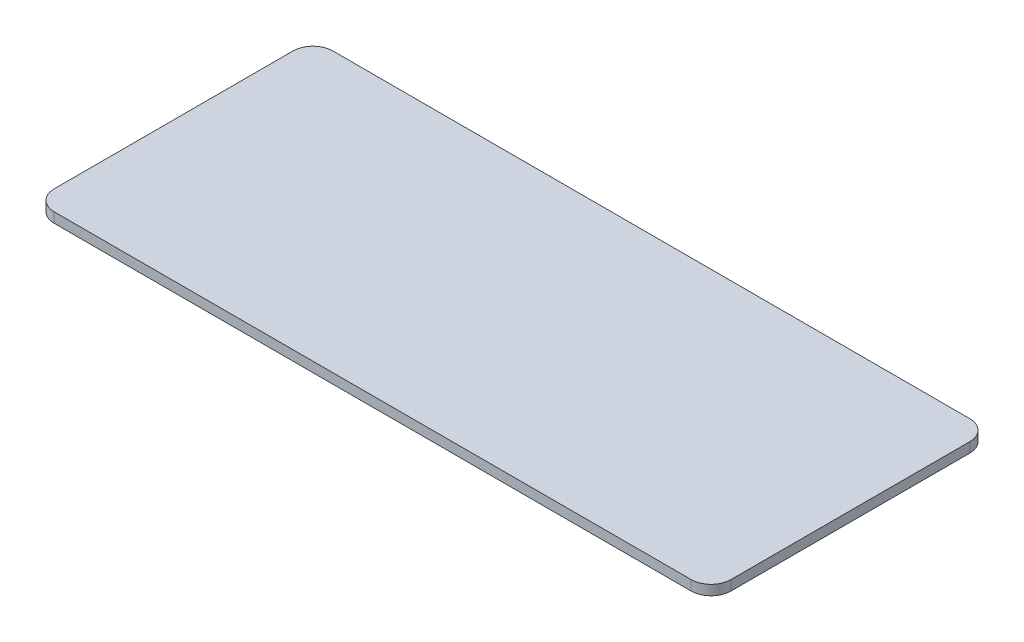
ISO-10303-21;
HEADER;
FILE_DESCRIPTION(('STEP AP214'),'2;1');
FILE_NAME('part.step','',(''),(''),'','','');
FILE_SCHEMA(('AUTOMOTIVE_DESIGN { 1 0 10303 214 1 1 1 1 }'));
ENDSEC;
DATA;
#1=APPLICATION_CONTEXT('core data for automotive mechanical design processes');
#2=APPLICATION_PROTOCOL_DEFINITION('international standard','automotive_design',2000,#1);
#3=PRODUCT_CONTEXT('',#1,'mechanical');
#4=PRODUCT('Part','Part','',(#3));
#5=PRODUCT_RELATED_PRODUCT_CATEGORY('part','',(#4));
#6=PRODUCT_DEFINITION_FORMATION('','',#4);
#7=PRODUCT_DEFINITION_CONTEXT('part definition',#1,'design');
#8=PRODUCT_DEFINITION('design','',#6,#7);
#9=PRODUCT_DEFINITION_SHAPE('','',#8);
#10=(LENGTH_UNIT() NAMED_UNIT(*) SI_UNIT(.MILLI.,.METRE.));
#11=(NAMED_UNIT(*) PLANE_ANGLE_UNIT() SI_UNIT($,.RADIAN.));
#12=(NAMED_UNIT(*) SI_UNIT($,.STERADIAN.) SOLID_ANGLE_UNIT());
#13=UNCERTAINTY_MEASURE_WITH_UNIT(LENGTH_MEASURE(1.E-05),#10,'distance_accuracy_value','');
#14=(GEOMETRIC_REPRESENTATION_CONTEXT(3) GLOBAL_UNCERTAINTY_ASSIGNED_CONTEXT((#13)) GLOBAL_UNIT_ASSIGNED_CONTEXT((#10,
#11,#12)) REPRESENTATION_CONTEXT('',''));
#15=CARTESIAN_POINT('',(0.,0.,0.));
#16=DIRECTION('',(0.,0.,1.));
#17=DIRECTION('',(1.,0.,0.));
#18=AXIS2_PLACEMENT_3D('',#15,#16,#17);
#19=CARTESIAN_POINT('',(30.6331658291457,1.,-12.7788944723618));
#20=DIRECTION('',(0.,-1.,0.));
#21=DIRECTION('',(0.,0.,-1.));
#22=AXIS2_PLACEMENT_3D('',#19,#20,#21);
#23=CYLINDRICAL_SURFACE('',#22,2.);
#24=CARTESIAN_POINT('',(30.6331658291457,0.,-12.7788944723618));
#25=DIRECTION('',(0.,1.,0.));
#26=DIRECTION('',(0.,0.,-1.));
#27=AXIS2_PLACEMENT_3D('',#24,#25,#26);
#28=CIRCLE('',#27,2.);
#29=CARTESIAN_POINT('',(32.6331658291457,0.,-12.7788944723618));
#30=VERTEX_POINT('',#29);
#31=CARTESIAN_POINT('',(30.6331658291457,0.,-14.7788944723618));
#32=VERTEX_POINT('',#31);
#33=EDGE_CURVE('E129',#30,#32,#28,.T.);
#34=ORIENTED_EDGE('',*,*,#33,.T.);
#35=DIRECTION('',(0.,-1.,0.));
#36=VECTOR('',#35,1.);
#37=CARTESIAN_POINT('',(30.6331658291457,1.,-14.7788944723618));
#38=LINE('',#37,#36);
#39=CARTESIAN_POINT('',(30.6331658291457,1.,-14.7788944723618));
#40=VERTEX_POINT('',#39);
#41=EDGE_CURVE('E11',#40,#32,#38,.T.);
#42=ORIENTED_EDGE('',*,*,#41,.F.);
#43=CARTESIAN_POINT('',(30.6331658291457,1.,-12.7788944723618));
#44=DIRECTION('',(0.,1.,0.));
#45=DIRECTION('',(0.,0.,-1.));
#46=AXIS2_PLACEMENT_3D('',#43,#44,#45);
#47=CIRCLE('',#46,2.);
#48=CARTESIAN_POINT('',(32.6331658291457,1.,-12.7788944723618));
#49=VERTEX_POINT('',#48);
#50=EDGE_CURVE('E143',#49,#40,#47,.T.);
#51=ORIENTED_EDGE('',*,*,#50,.F.);
#52=DIRECTION('',(0.,-1.,0.));
#53=VECTOR('',#52,1.);
#54=CARTESIAN_POINT('',(32.6331658291457,1.,-12.7788944723618));
#55=LINE('',#54,#53);
#56=EDGE_CURVE('E125',#49,#30,#55,.T.);
#57=ORIENTED_EDGE('',*,*,#56,.T.);
#58=EDGE_LOOP('',(#34,#42,#51,#57));
#59=FACE_BOUND('',#58,.T.);
#60=ADVANCED_FACE('F33',(#59),#23,.T.);
#61=CARTESIAN_POINT('',(-33.3668341708543,1.,-14.7788944723618));
#62=DIRECTION('',(0.,0.,1.));
#63=DIRECTION('',(1.,0.,0.));
#64=AXIS2_PLACEMENT_3D('',#61,#62,#63);
#65=PLANE('',#64);
#66=DIRECTION('',(-1.,0.,0.));
#67=VECTOR('',#66,1.);
#68=CARTESIAN_POINT('',(-33.3668341708543,0.,-14.7788944723618));
#69=LINE('',#68,#67);
#70=CARTESIAN_POINT('',(-33.3668341708543,0.,-14.7788944723618));
#71=VERTEX_POINT('',#70);
#72=EDGE_CURVE('E132',#32,#71,#69,.T.);
#73=ORIENTED_EDGE('',*,*,#72,.T.);
#74=DIRECTION('',(0.,-1.,0.));
#75=VECTOR('',#74,1.);
#76=CARTESIAN_POINT('',(-33.3668341708543,1.,-14.7788944723618));
#77=LINE('',#76,#75);
#78=CARTESIAN_POINT('',(-33.3668341708543,1.,-14.7788944723618));
#79=VERTEX_POINT('',#78);
#80=EDGE_CURVE('E41',#79,#71,#77,.T.);
#81=ORIENTED_EDGE('',*,*,#80,.F.);
#82=DIRECTION('',(-1.,0.,0.));
#83=VECTOR('',#82,1.);
#84=CARTESIAN_POINT('',(-33.3668341708543,1.,-14.7788944723618));
#85=LINE('',#84,#83);
#86=EDGE_CURVE('E92',#40,#79,#85,.T.);
#87=ORIENTED_EDGE('',*,*,#86,.F.);
#88=ORIENTED_EDGE('',*,*,#41,.T.);
#89=EDGE_LOOP('',(#73,#81,#87,#88));
#90=FACE_BOUND('',#89,.T.);
#91=ADVANCED_FACE('F178',(#90),#65,.F.);
#92=CARTESIAN_POINT('',(-33.3668341708543,1.,-12.7788944723618));
#93=DIRECTION('',(0.,-1.,0.));
#94=DIRECTION('',(0.,0.,-1.));
#95=AXIS2_PLACEMENT_3D('',#92,#93,#94);
#96=CYLINDRICAL_SURFACE('',#95,2.);
#97=CARTESIAN_POINT('',(-33.3668341708543,0.,-12.7788944723618));
#98=DIRECTION('',(0.,1.,0.));
#99=DIRECTION('',(0.,0.,1.));
#100=AXIS2_PLACEMENT_3D('',#97,#98,#99);
#101=CIRCLE('',#100,2.);
#102=CARTESIAN_POINT('',(-35.3668341708543,0.,-12.7788944723618));
#103=VERTEX_POINT('',#102);
#104=EDGE_CURVE('E134',#71,#103,#101,.T.);
#105=ORIENTED_EDGE('',*,*,#104,.T.);
#106=DIRECTION('',(0.,-1.,0.));
#107=VECTOR('',#106,1.);
#108=CARTESIAN_POINT('',(-35.3668341708543,1.,-12.7788944723618));
#109=LINE('',#108,#107);
#110=CARTESIAN_POINT('',(-35.3668341708543,1.,-12.7788944723618));
#111=VERTEX_POINT('',#110);
#112=EDGE_CURVE('E150',#111,#103,#109,.T.);
#113=ORIENTED_EDGE('',*,*,#112,.F.);
#114=CARTESIAN_POINT('',(-33.3668341708543,1.,-12.7788944723618));
#115=DIRECTION('',(0.,1.,0.));
#116=DIRECTION('',(0.,0.,1.));
#117=AXIS2_PLACEMENT_3D('',#114,#115,#116);
#118=CIRCLE('',#117,2.);
#119=EDGE_CURVE('E158',#79,#111,#118,.T.);
#120=ORIENTED_EDGE('',*,*,#119,.F.);
#121=ORIENTED_EDGE('',*,*,#80,.T.);
#122=EDGE_LOOP('',(#105,#113,#120,#121));
#123=FACE_BOUND('',#122,.T.);
#124=ADVANCED_FACE('F156',(#123),#96,.T.);
#125=CARTESIAN_POINT('',(-35.3668341708543,1.,-12.7788944723618));
#126=DIRECTION('',(1.,0.,0.));
#127=DIRECTION('',(0.,0.,-1.));
#128=AXIS2_PLACEMENT_3D('',#125,#126,#127);
#129=PLANE('',#128);
#130=DIRECTION('',(0.,0.,1.));
#131=VECTOR('',#130,1.);
#132=CARTESIAN_POINT('',(-35.3668341708543,0.,-12.7788944723618));
#133=LINE('',#132,#131);
#134=CARTESIAN_POINT('',(-35.3668341708543,0.,11.2211055276382));
#135=VERTEX_POINT('',#134);
#136=EDGE_CURVE('E136',#103,#135,#133,.T.);
#137=ORIENTED_EDGE('',*,*,#136,.T.);
#138=DIRECTION('',(0.,-1.,0.));
#139=VECTOR('',#138,1.);
#140=CARTESIAN_POINT('',(-35.3668341708543,1.,11.2211055276382));
#141=LINE('',#140,#139);
#142=CARTESIAN_POINT('',(-35.3668341708543,1.,11.2211055276382));
#143=VERTEX_POINT('',#142);
#144=EDGE_CURVE('E147',#143,#135,#141,.T.);
#145=ORIENTED_EDGE('',*,*,#144,.F.);
#146=DIRECTION('',(0.,0.,1.));
#147=VECTOR('',#146,1.);
#148=CARTESIAN_POINT('',(-35.3668341708543,1.,-12.7788944723618));
#149=LINE('',#148,#147);
#150=EDGE_CURVE('E170',#111,#143,#149,.T.);
#151=ORIENTED_EDGE('',*,*,#150,.F.);
#152=ORIENTED_EDGE('',*,*,#112,.T.);
#153=EDGE_LOOP('',(#137,#145,#151,#152));
#154=FACE_BOUND('',#153,.T.);
#155=ADVANCED_FACE('F166',(#154),#129,.F.);
#156=CARTESIAN_POINT('',(-33.3668341708543,1.,11.2211055276382));
#157=DIRECTION('',(0.,-1.,0.));
#158=DIRECTION('',(0.,0.,-1.));
#159=AXIS2_PLACEMENT_3D('',#156,#157,#158);
#160=CYLINDRICAL_SURFACE('',#159,2.);
#161=CARTESIAN_POINT('',(-33.3668341708543,0.,11.2211055276382));
#162=DIRECTION('',(0.,1.,0.));
#163=DIRECTION('',(0.,0.,1.));
#164=AXIS2_PLACEMENT_3D('',#161,#162,#163);
#165=CIRCLE('',#164,2.);
#166=CARTESIAN_POINT('',(-33.3668341708543,0.,13.2211055276382));
#167=VERTEX_POINT('',#166);
#168=EDGE_CURVE('E138',#135,#167,#165,.T.);
#169=ORIENTED_EDGE('',*,*,#168,.T.);
#170=DIRECTION('',(0.,-1.,0.));
#171=VECTOR('',#170,1.);
#172=CARTESIAN_POINT('',(-33.3668341708543,1.,13.2211055276382));
#173=LINE('',#172,#171);
#174=CARTESIAN_POINT('',(-33.3668341708543,1.,13.2211055276382));
#175=VERTEX_POINT('',#174);
#176=EDGE_CURVE('E120',#175,#167,#173,.T.);
#177=ORIENTED_EDGE('',*,*,#176,.F.);
#178=CARTESIAN_POINT('',(-33.3668341708543,1.,11.2211055276382));
#179=DIRECTION('',(0.,1.,0.));
#180=DIRECTION('',(0.,0.,1.));
#181=AXIS2_PLACEMENT_3D('',#178,#179,#180);
#182=CIRCLE('',#181,2.);
#183=EDGE_CURVE('E111',#143,#175,#182,.T.);
#184=ORIENTED_EDGE('',*,*,#183,.F.);
#185=ORIENTED_EDGE('',*,*,#144,.T.);
#186=EDGE_LOOP('',(#169,#177,#184,#185));
#187=FACE_BOUND('',#186,.T.);
#188=ADVANCED_FACE('F169',(#187),#160,.T.);
#189=CARTESIAN_POINT('',(-33.3668341708543,1.,13.2211055276382));
#190=DIRECTION('',(0.,0.,-1.));
#191=DIRECTION('',(-1.,0.,0.));
#192=AXIS2_PLACEMENT_3D('',#189,#190,#191);
#193=PLANE('',#192);
#194=DIRECTION('',(1.,0.,0.));
#195=VECTOR('',#194,1.);
#196=CARTESIAN_POINT('',(-33.3668341708543,0.,13.2211055276382));
#197=LINE('',#196,#195);
#198=CARTESIAN_POINT('',(30.6331658291457,0.,13.2211055276382));
#199=VERTEX_POINT('',#198);
#200=EDGE_CURVE('E119',#167,#199,#197,.T.);
#201=ORIENTED_EDGE('',*,*,#200,.T.);
#202=DIRECTION('',(0.,-1.,0.));
#203=VECTOR('',#202,1.);
#204=CARTESIAN_POINT('',(30.6331658291457,1.,13.2211055276382));
#205=LINE('',#204,#203);
#206=CARTESIAN_POINT('',(30.6331658291457,1.,13.2211055276382));
#207=VERTEX_POINT('',#206);
#208=EDGE_CURVE('E116',#207,#199,#205,.T.);
#209=ORIENTED_EDGE('',*,*,#208,.F.);
#210=DIRECTION('',(1.,0.,0.));
#211=VECTOR('',#210,1.);
#212=CARTESIAN_POINT('',(-33.3668341708543,1.,13.2211055276382));
#213=LINE('',#212,#211);
#214=EDGE_CURVE('E105',#175,#207,#213,.T.);
#215=ORIENTED_EDGE('',*,*,#214,.F.);
#216=ORIENTED_EDGE('',*,*,#176,.T.);
#217=EDGE_LOOP('',(#201,#209,#215,#216));
#218=FACE_BOUND('',#217,.T.);
#219=ADVANCED_FACE('F117',(#218),#193,.F.);
#220=CARTESIAN_POINT('',(30.6331658291457,1.,11.2211055276382));
#221=DIRECTION('',(0.,-1.,0.));
#222=DIRECTION('',(0.,0.,-1.));
#223=AXIS2_PLACEMENT_3D('',#220,#221,#222);
#224=CYLINDRICAL_SURFACE('',#223,2.);
#225=CARTESIAN_POINT('',(30.6331658291457,0.,11.2211055276382));
#226=DIRECTION('',(0.,1.,0.));
#227=DIRECTION('',(0.,0.,1.));
#228=AXIS2_PLACEMENT_3D('',#225,#226,#227);
#229=CIRCLE('',#228,2.);
#230=CARTESIAN_POINT('',(32.6331658291457,0.,11.2211055276382));
#231=VERTEX_POINT('',#230);
#232=EDGE_CURVE('E78',#199,#231,#229,.T.);
#233=ORIENTED_EDGE('',*,*,#232,.T.);
#234=DIRECTION('',(0.,-1.,0.));
#235=VECTOR('',#234,1.);
#236=CARTESIAN_POINT('',(32.6331658291457,1.,11.2211055276382));
#237=LINE('',#236,#235);
#238=CARTESIAN_POINT('',(32.6331658291457,1.,11.2211055276382));
#239=VERTEX_POINT('',#238);
#240=EDGE_CURVE('E121',#239,#231,#237,.T.);
#241=ORIENTED_EDGE('',*,*,#240,.F.);
#242=CARTESIAN_POINT('',(30.6331658291457,1.,11.2211055276382));
#243=DIRECTION('',(0.,1.,0.));
#244=DIRECTION('',(0.,0.,1.));
#245=AXIS2_PLACEMENT_3D('',#242,#243,#244);
#246=CIRCLE('',#245,2.);
#247=EDGE_CURVE('E109',#207,#239,#246,.T.);
#248=ORIENTED_EDGE('',*,*,#247,.F.);
#249=ORIENTED_EDGE('',*,*,#208,.T.);
#250=EDGE_LOOP('',(#233,#241,#248,#249));
#251=FACE_BOUND('',#250,.T.);
#252=ADVANCED_FACE('F123',(#251),#224,.T.);
#253=CARTESIAN_POINT('',(32.6331658291457,1.,-12.7788944723618));
#254=DIRECTION('',(-1.,0.,0.));
#255=DIRECTION('',(0.,0.,1.));
#256=AXIS2_PLACEMENT_3D('',#253,#254,#255);
#257=PLANE('',#256);
#258=DIRECTION('',(0.,0.,-1.));
#259=VECTOR('',#258,1.);
#260=CARTESIAN_POINT('',(32.6331658291457,0.,-12.7788944723618));
#261=LINE('',#260,#259);
#262=EDGE_CURVE('E84',#231,#30,#261,.T.);
#263=ORIENTED_EDGE('',*,*,#262,.T.);
#264=ORIENTED_EDGE('',*,*,#56,.F.);
#265=DIRECTION('',(0.,0.,-1.));
#266=VECTOR('',#265,1.);
#267=CARTESIAN_POINT('',(32.6331658291457,1.,-12.7788944723618));
#268=LINE('',#267,#266);
#269=EDGE_CURVE('E49',#239,#49,#268,.T.);
#270=ORIENTED_EDGE('',*,*,#269,.F.);
#271=ORIENTED_EDGE('',*,*,#240,.T.);
#272=EDGE_LOOP('',(#263,#264,#270,#271));
#273=FACE_BOUND('',#272,.T.);
#274=ADVANCED_FACE('F194',(#273),#257,.F.);
#275=CARTESIAN_POINT('',(30.6331658291457,1.,-12.7788944723618));
#276=DIRECTION('',(0.,-1.,0.));
#277=DIRECTION('',(0.,0.,-1.));
#278=AXIS2_PLACEMENT_3D('',#275,#276,#277);
#279=PLANE('',#278);
#280=ORIENTED_EDGE('',*,*,#50,.T.);
#281=ORIENTED_EDGE('',*,*,#86,.T.);
#282=ORIENTED_EDGE('',*,*,#119,.T.);
#283=ORIENTED_EDGE('',*,*,#150,.T.);
#284=ORIENTED_EDGE('',*,*,#183,.T.);
#285=ORIENTED_EDGE('',*,*,#214,.T.);
#286=ORIENTED_EDGE('',*,*,#247,.T.);
#287=ORIENTED_EDGE('',*,*,#269,.T.);
#288=EDGE_LOOP('',(#280,#281,#282,#283,#284,#285,#286,#287));
#289=FACE_BOUND('',#288,.T.);
#290=ADVANCED_FACE('F107',(#289),#279,.F.);
#291=CARTESIAN_POINT('',(30.6331658291457,0.,-12.7788944723618));
#292=DIRECTION('',(0.,-1.,0.));
#293=DIRECTION('',(0.,0.,-1.));
#294=AXIS2_PLACEMENT_3D('',#291,#292,#293);
#295=PLANE('',#294);
#296=ORIENTED_EDGE('',*,*,#33,.F.);
#297=ORIENTED_EDGE('',*,*,#262,.F.);
#298=ORIENTED_EDGE('',*,*,#232,.F.);
#299=ORIENTED_EDGE('',*,*,#200,.F.);
#300=ORIENTED_EDGE('',*,*,#168,.F.);
#301=ORIENTED_EDGE('',*,*,#136,.F.);
#302=ORIENTED_EDGE('',*,*,#104,.F.);
#303=ORIENTED_EDGE('',*,*,#72,.F.);
#304=EDGE_LOOP('',(#296,#297,#298,#299,#300,#301,#302,#303));
#305=FACE_BOUND('',#304,.T.);
#306=ADVANCED_FACE('F162',(#305),#295,.T.);
#307=CLOSED_SHELL('',(#60,#91,#124,#155,#188,#219,#252,#274,#290,#306));
#308=MANIFOLD_SOLID_BREP('B2',#307);
#309=ADVANCED_BREP_SHAPE_REPRESENTATION('',(#18,#308),#14);
#310=SHAPE_DEFINITION_REPRESENTATION(#9,#309);
ENDSEC;
END-ISO-10303-21;
